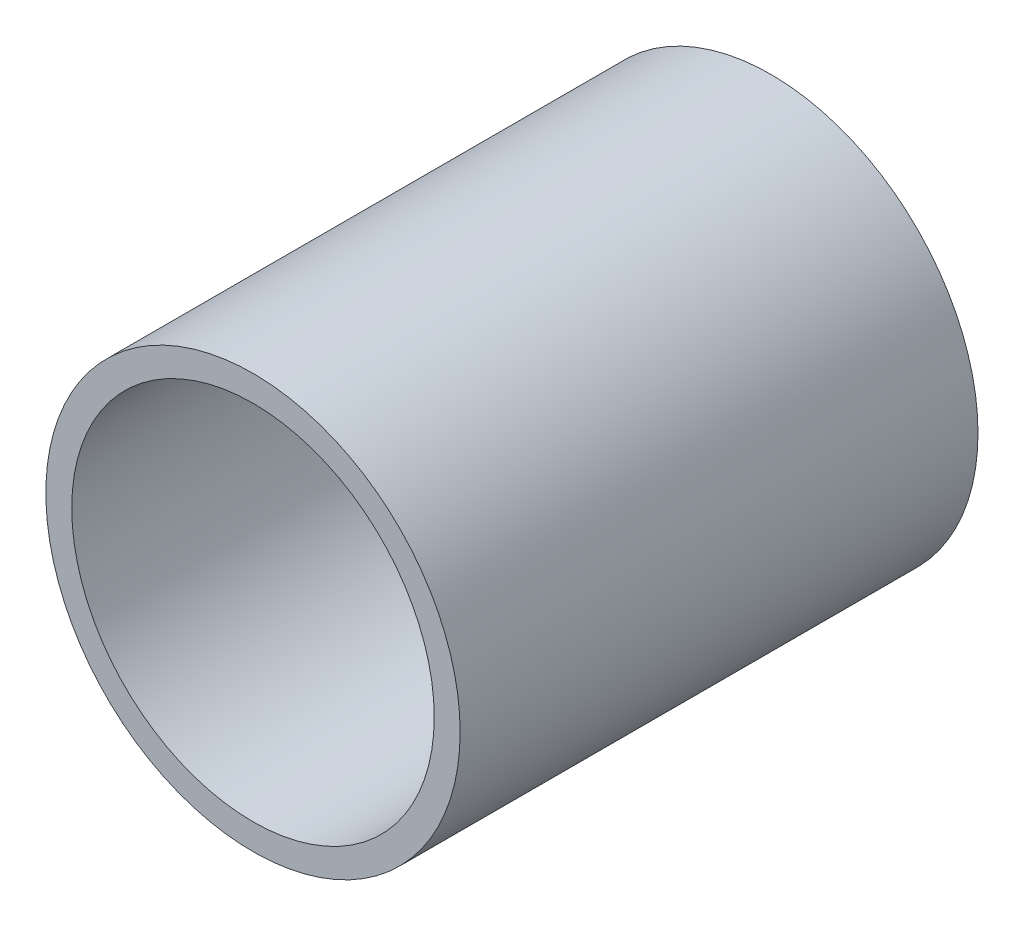
ISO-10303-21;
HEADER;
FILE_DESCRIPTION(('STEP AP214'),'2;1');
FILE_NAME('part.step','',(''),(''),'','','');
FILE_SCHEMA(('AUTOMOTIVE_DESIGN { 1 0 10303 214 1 1 1 1 }'));
ENDSEC;
DATA;
#1=APPLICATION_CONTEXT('core data for automotive mechanical design processes');
#2=APPLICATION_PROTOCOL_DEFINITION('international standard','automotive_design',2000,#1);
#3=PRODUCT_CONTEXT('',#1,'mechanical');
#4=PRODUCT('Part','Part','',(#3));
#5=PRODUCT_RELATED_PRODUCT_CATEGORY('part','',(#4));
#6=PRODUCT_DEFINITION_FORMATION('','',#4);
#7=PRODUCT_DEFINITION_CONTEXT('part definition',#1,'design');
#8=PRODUCT_DEFINITION('design','',#6,#7);
#9=PRODUCT_DEFINITION_SHAPE('','',#8);
#10=(LENGTH_UNIT() NAMED_UNIT(*) SI_UNIT(.MILLI.,.METRE.));
#11=(NAMED_UNIT(*) PLANE_ANGLE_UNIT() SI_UNIT($,.RADIAN.));
#12=(NAMED_UNIT(*) SI_UNIT($,.STERADIAN.) SOLID_ANGLE_UNIT());
#13=UNCERTAINTY_MEASURE_WITH_UNIT(LENGTH_MEASURE(1.E-05),#10,'distance_accuracy_value','');
#14=(GEOMETRIC_REPRESENTATION_CONTEXT(3) GLOBAL_UNCERTAINTY_ASSIGNED_CONTEXT((#13)) GLOBAL_UNIT_ASSIGNED_CONTEXT((#10,
#11,#12)) REPRESENTATION_CONTEXT('',''));
#15=CARTESIAN_POINT('',(0.,0.,0.));
#16=DIRECTION('',(0.,0.,1.));
#17=DIRECTION('',(1.,0.,0.));
#18=AXIS2_PLACEMENT_3D('',#15,#16,#17);
#19=CARTESIAN_POINT('',(0.,0.,10.));
#20=DIRECTION('',(0.,0.,1.));
#21=DIRECTION('',(1.,0.,0.));
#22=AXIS2_PLACEMENT_3D('',#19,#20,#21);
#23=PLANE('',#22);
#24=CARTESIAN_POINT('',(0.,0.,10.));
#25=DIRECTION('',(0.,0.,1.));
#26=DIRECTION('',(1.,0.,0.));
#27=AXIS2_PLACEMENT_3D('',#24,#25,#26);
#28=CIRCLE('',#27,4.);
#29=CARTESIAN_POINT('',(4.,0.,10.));
#30=VERTEX_POINT('',#29);
#31=EDGE_CURVE('E10',#30,#30,#28,.T.);
#32=ORIENTED_EDGE('',*,*,#31,.T.);
#33=EDGE_LOOP('',(#32));
#34=FACE_BOUND('',#33,.T.);
#35=CARTESIAN_POINT('',(0.,0.,10.));
#36=DIRECTION('',(0.,0.,1.));
#37=DIRECTION('',(1.,0.,0.));
#38=AXIS2_PLACEMENT_3D('',#35,#36,#37);
#39=CIRCLE('',#38,3.5);
#40=CARTESIAN_POINT('',(3.5,0.,10.));
#41=VERTEX_POINT('',#40);
#42=EDGE_CURVE('E44',#41,#41,#39,.T.);
#43=ORIENTED_EDGE('',*,*,#42,.F.);
#44=EDGE_LOOP('',(#43));
#45=FACE_BOUND('',#44,.T.);
#46=ADVANCED_FACE('F33',(#34,#45),#23,.T.);
#47=CARTESIAN_POINT('',(0.,0.,0.));
#48=DIRECTION('',(0.,0.,1.));
#49=DIRECTION('',(1.,0.,0.));
#50=AXIS2_PLACEMENT_3D('',#47,#48,#49);
#51=PLANE('',#50);
#52=CARTESIAN_POINT('',(0.,0.,0.));
#53=DIRECTION('',(0.,0.,1.));
#54=DIRECTION('',(1.,0.,0.));
#55=AXIS2_PLACEMENT_3D('',#52,#53,#54);
#56=CIRCLE('',#55,4.);
#57=CARTESIAN_POINT('',(4.,0.,0.));
#58=VERTEX_POINT('',#57);
#59=EDGE_CURVE('E37',#58,#58,#56,.T.);
#60=ORIENTED_EDGE('',*,*,#59,.F.);
#61=EDGE_LOOP('',(#60));
#62=FACE_BOUND('',#61,.T.);
#63=CARTESIAN_POINT('',(0.,0.,0.));
#64=DIRECTION('',(0.,0.,1.));
#65=DIRECTION('',(1.,0.,0.));
#66=AXIS2_PLACEMENT_3D('',#63,#64,#65);
#67=CIRCLE('',#66,3.5);
#68=CARTESIAN_POINT('',(3.5,0.,0.));
#69=VERTEX_POINT('',#68);
#70=EDGE_CURVE('E46',#69,#69,#67,.T.);
#71=ORIENTED_EDGE('',*,*,#70,.T.);
#72=EDGE_LOOP('',(#71));
#73=FACE_BOUND('',#72,.T.);
#74=ADVANCED_FACE('F56',(#62,#73),#51,.F.);
#75=CARTESIAN_POINT('',(0.,0.,10.));
#76=DIRECTION('',(0.,0.,-1.));
#77=DIRECTION('',(-1.,0.,0.));
#78=AXIS2_PLACEMENT_3D('',#75,#76,#77);
#79=CYLINDRICAL_SURFACE('',#78,4.);
#80=ORIENTED_EDGE('',*,*,#31,.F.);
#81=EDGE_LOOP('',(#80));
#82=FACE_BOUND('',#81,.T.);
#83=ORIENTED_EDGE('',*,*,#59,.T.);
#84=EDGE_LOOP('',(#83));
#85=FACE_BOUND('',#84,.T.);
#86=ADVANCED_FACE('F35',(#82,#85),#79,.T.);
#87=CARTESIAN_POINT('',(0.,0.,10.));
#88=DIRECTION('',(0.,0.,-1.));
#89=DIRECTION('',(-1.,0.,0.));
#90=AXIS2_PLACEMENT_3D('',#87,#88,#89);
#91=CYLINDRICAL_SURFACE('',#90,3.5);
#92=ORIENTED_EDGE('',*,*,#42,.T.);
#93=EDGE_LOOP('',(#92));
#94=FACE_BOUND('',#93,.T.);
#95=ORIENTED_EDGE('',*,*,#70,.F.);
#96=EDGE_LOOP('',(#95));
#97=FACE_BOUND('',#96,.T.);
#98=ADVANCED_FACE('F52',(#94,#97),#91,.F.);
#99=CLOSED_SHELL('',(#46,#74,#86,#98));
#100=MANIFOLD_SOLID_BREP('B2',#99);
#101=ADVANCED_BREP_SHAPE_REPRESENTATION('',(#18,#100),#14);
#102=SHAPE_DEFINITION_REPRESENTATION(#9,#101);
ENDSEC;
END-ISO-10303-21;
